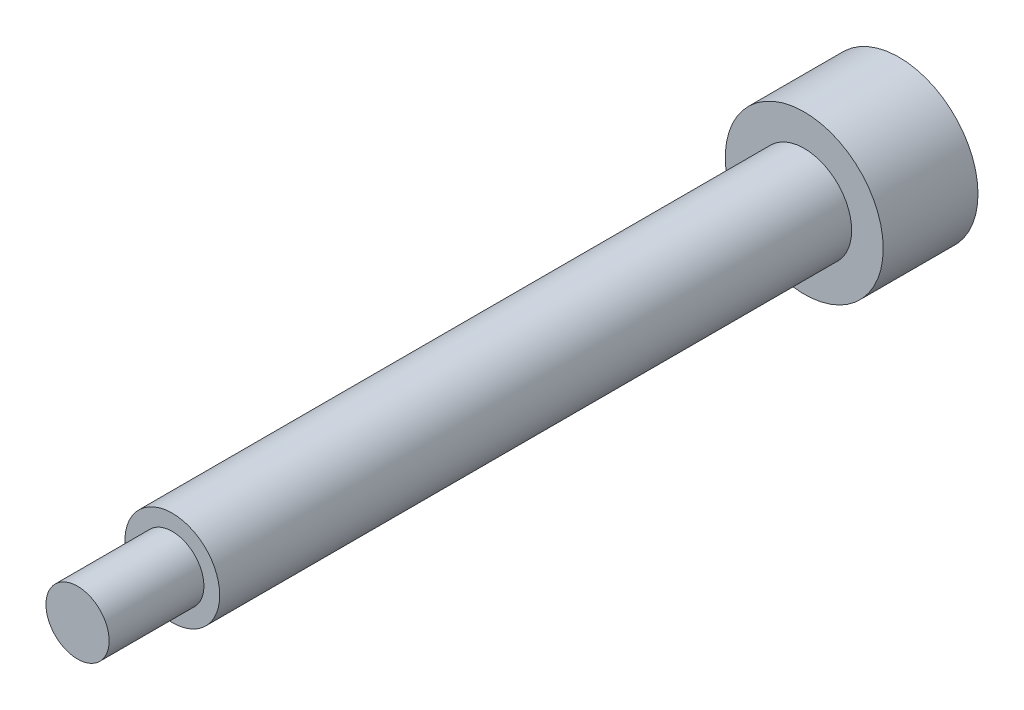
ISO-10303-21;
HEADER;
FILE_DESCRIPTION(('STEP AP214'),'2;1');
FILE_NAME('part.step','',(''),(''),'','','');
FILE_SCHEMA(('AUTOMOTIVE_DESIGN { 1 0 10303 214 1 1 1 1 }'));
ENDSEC;
DATA;
#1=APPLICATION_CONTEXT('core data for automotive mechanical design processes');
#2=APPLICATION_PROTOCOL_DEFINITION('international standard','automotive_design',2000,#1);
#3=PRODUCT_CONTEXT('',#1,'mechanical');
#4=PRODUCT('Part','Part','',(#3));
#5=PRODUCT_RELATED_PRODUCT_CATEGORY('part','',(#4));
#6=PRODUCT_DEFINITION_FORMATION('','',#4);
#7=PRODUCT_DEFINITION_CONTEXT('part definition',#1,'design');
#8=PRODUCT_DEFINITION('design','',#6,#7);
#9=PRODUCT_DEFINITION_SHAPE('','',#8);
#10=(LENGTH_UNIT() NAMED_UNIT(*) SI_UNIT(.MILLI.,.METRE.));
#11=(NAMED_UNIT(*) PLANE_ANGLE_UNIT() SI_UNIT($,.RADIAN.));
#12=(NAMED_UNIT(*) SI_UNIT($,.STERADIAN.) SOLID_ANGLE_UNIT());
#13=UNCERTAINTY_MEASURE_WITH_UNIT(LENGTH_MEASURE(1.E-05),#10,'distance_accuracy_value','');
#14=(GEOMETRIC_REPRESENTATION_CONTEXT(3) GLOBAL_UNCERTAINTY_ASSIGNED_CONTEXT((#13)) GLOBAL_UNIT_ASSIGNED_CONTEXT((#10,
#11,#12)) REPRESENTATION_CONTEXT('',''));
#15=CARTESIAN_POINT('',(0.,0.,0.));
#16=DIRECTION('',(0.,0.,1.));
#17=DIRECTION('',(1.,0.,0.));
#18=AXIS2_PLACEMENT_3D('',#15,#16,#17);
#19=CARTESIAN_POINT('',(0.,0.,0.));
#20=DIRECTION('',(0.,0.,1.));
#21=DIRECTION('',(1.,0.,0.));
#22=AXIS2_PLACEMENT_3D('',#19,#20,#21);
#23=PLANE('',#22);
#24=CARTESIAN_POINT('',(0.,0.,0.));
#25=DIRECTION('',(0.,0.,1.));
#26=DIRECTION('',(1.,0.,0.));
#27=AXIS2_PLACEMENT_3D('',#24,#25,#26);
#28=CIRCLE('',#27,5.);
#29=CARTESIAN_POINT('',(5.,0.,0.));
#30=VERTEX_POINT('',#29);
#31=EDGE_CURVE('E43',#30,#30,#28,.T.);
#32=ORIENTED_EDGE('',*,*,#31,.F.);
#33=EDGE_LOOP('',(#32));
#34=FACE_BOUND('',#33,.T.);
#35=DIRECTION('',(1.,0.,0.));
#36=VECTOR('',#35,1.);
#37=CARTESIAN_POINT('',(0.,-1.,0.));
#38=LINE('',#37,#36);
#39=CARTESIAN_POINT('',(-1.1180339887499,-1.,0.));
#40=VERTEX_POINT('',#39);
#41=CARTESIAN_POINT('',(1.1180339887499,-1.,0.));
#42=VERTEX_POINT('',#41);
#43=EDGE_CURVE('E57',#40,#42,#38,.T.);
#44=ORIENTED_EDGE('',*,*,#43,.T.);
#45=CARTESIAN_POINT('',(0.,0.,0.));
#46=DIRECTION('',(0.,0.,-1.));
#47=DIRECTION('',(-1.,0.,0.));
#48=AXIS2_PLACEMENT_3D('',#45,#46,#47);
#49=CIRCLE('',#48,1.5);
#50=EDGE_CURVE('E77',#40,#42,#49,.T.);
#51=ORIENTED_EDGE('',*,*,#50,.F.);
#52=EDGE_LOOP('',(#44,#51));
#53=FACE_BOUND('',#52,.T.);
#54=ADVANCED_FACE('F39',(#34,#53),#23,.F.);
#55=CARTESIAN_POINT('',(0.,0.,6.));
#56=DIRECTION('',(0.,0.,-1.));
#57=DIRECTION('',(-1.,0.,0.));
#58=AXIS2_PLACEMENT_3D('',#55,#56,#57);
#59=CYLINDRICAL_SURFACE('',#58,5.);
#60=CARTESIAN_POINT('',(0.,0.,6.));
#61=DIRECTION('',(0.,0.,1.));
#62=DIRECTION('',(1.,0.,0.));
#63=AXIS2_PLACEMENT_3D('',#60,#61,#62);
#64=CIRCLE('',#63,5.);
#65=CARTESIAN_POINT('',(5.,0.,6.));
#66=VERTEX_POINT('',#65);
#67=EDGE_CURVE('E94',#66,#66,#64,.T.);
#68=ORIENTED_EDGE('',*,*,#67,.F.);
#69=EDGE_LOOP('',(#68));
#70=FACE_BOUND('',#69,.T.);
#71=ORIENTED_EDGE('',*,*,#31,.T.);
#72=EDGE_LOOP('',(#71));
#73=FACE_BOUND('',#72,.T.);
#74=ADVANCED_FACE('F41',(#70,#73),#59,.T.);
#75=CARTESIAN_POINT('',(0.,0.,6.));
#76=DIRECTION('',(0.,0.,1.));
#77=DIRECTION('',(1.,0.,0.));
#78=AXIS2_PLACEMENT_3D('',#75,#76,#77);
#79=PLANE('',#78);
#80=CARTESIAN_POINT('',(0.,0.,6.));
#81=DIRECTION('',(0.,0.,1.));
#82=DIRECTION('',(1.,0.,0.));
#83=AXIS2_PLACEMENT_3D('',#80,#81,#82);
#84=CIRCLE('',#83,3.);
#85=CARTESIAN_POINT('',(3.,0.,6.));
#86=VERTEX_POINT('',#85);
#87=EDGE_CURVE('E49',#86,#86,#84,.T.);
#88=ORIENTED_EDGE('',*,*,#87,.F.);
#89=EDGE_LOOP('',(#88));
#90=FACE_BOUND('',#89,.T.);
#91=ORIENTED_EDGE('',*,*,#67,.T.);
#92=EDGE_LOOP('',(#91));
#93=FACE_BOUND('',#92,.T.);
#94=ADVANCED_FACE('F111',(#90,#93),#79,.T.);
#95=CARTESIAN_POINT('',(0.,-1.,5.));
#96=DIRECTION('',(0.,1.,0.));
#97=DIRECTION('',(0.,0.,1.));
#98=AXIS2_PLACEMENT_3D('',#95,#96,#97);
#99=PLANE('',#98);
#100=ORIENTED_EDGE('',*,*,#43,.F.);
#101=DIRECTION('',(0.,0.,-1.));
#102=VECTOR('',#101,1.);
#103=CARTESIAN_POINT('',(-1.1180339887499,-1.,5.));
#104=LINE('',#103,#102);
#105=CARTESIAN_POINT('',(-1.1180339887499,-1.,5.));
#106=VERTEX_POINT('',#105);
#107=EDGE_CURVE('E74',#106,#40,#104,.T.);
#108=ORIENTED_EDGE('',*,*,#107,.F.);
#109=DIRECTION('',(1.,0.,0.));
#110=VECTOR('',#109,1.);
#111=CARTESIAN_POINT('',(0.,-1.,5.));
#112=LINE('',#111,#110);
#113=CARTESIAN_POINT('',(1.1180339887499,-1.,5.));
#114=VERTEX_POINT('',#113);
#115=EDGE_CURVE('E63',#106,#114,#112,.T.);
#116=ORIENTED_EDGE('',*,*,#115,.T.);
#117=DIRECTION('',(0.,0.,-1.));
#118=VECTOR('',#117,1.);
#119=CARTESIAN_POINT('',(1.1180339887499,-1.,5.));
#120=LINE('',#119,#118);
#121=EDGE_CURVE('E67',#114,#42,#120,.T.);
#122=ORIENTED_EDGE('',*,*,#121,.T.);
#123=EDGE_LOOP('',(#100,#108,#116,#122));
#124=FACE_BOUND('',#123,.T.);
#125=ADVANCED_FACE('F69',(#124),#99,.T.);
#126=CARTESIAN_POINT('',(0.,0.,5.));
#127=DIRECTION('',(0.,0.,-1.));
#128=DIRECTION('',(-1.,0.,0.));
#129=AXIS2_PLACEMENT_3D('',#126,#127,#128);
#130=CYLINDRICAL_SURFACE('',#129,1.5);
#131=ORIENTED_EDGE('',*,*,#50,.T.);
#132=ORIENTED_EDGE('',*,*,#121,.F.);
#133=CARTESIAN_POINT('',(0.,0.,5.));
#134=DIRECTION('',(0.,0.,-1.));
#135=DIRECTION('',(-1.,0.,0.));
#136=AXIS2_PLACEMENT_3D('',#133,#134,#135);
#137=CIRCLE('',#136,1.5);
#138=EDGE_CURVE('E90',#106,#114,#137,.T.);
#139=ORIENTED_EDGE('',*,*,#138,.F.);
#140=ORIENTED_EDGE('',*,*,#107,.T.);
#141=EDGE_LOOP('',(#131,#132,#139,#140));
#142=FACE_BOUND('',#141,.T.);
#143=ADVANCED_FACE('F78',(#142),#130,.F.);
#144=CARTESIAN_POINT('',(0.,0.,5.));
#145=DIRECTION('',(0.,0.,-1.));
#146=DIRECTION('',(-1.,0.,0.));
#147=AXIS2_PLACEMENT_3D('',#144,#145,#146);
#148=PLANE('',#147);
#149=ORIENTED_EDGE('',*,*,#115,.F.);
#150=ORIENTED_EDGE('',*,*,#138,.T.);
#151=EDGE_LOOP('',(#149,#150));
#152=FACE_BOUND('',#151,.T.);
#153=ADVANCED_FACE('F121',(#152),#148,.T.);
#154=CARTESIAN_POINT('',(0.,0.,46.));
#155=DIRECTION('',(0.,0.,-1.));
#156=DIRECTION('',(-1.,0.,0.));
#157=AXIS2_PLACEMENT_3D('',#154,#155,#156);
#158=CYLINDRICAL_SURFACE('',#157,3.);
#159=CARTESIAN_POINT('',(0.,0.,46.));
#160=DIRECTION('',(0.,0.,1.));
#161=DIRECTION('',(1.,0.,0.));
#162=AXIS2_PLACEMENT_3D('',#159,#160,#161);
#163=CIRCLE('',#162,3.);
#164=CARTESIAN_POINT('',(3.,0.,46.));
#165=VERTEX_POINT('',#164);
#166=EDGE_CURVE('E83',#165,#165,#163,.T.);
#167=ORIENTED_EDGE('',*,*,#166,.F.);
#168=EDGE_LOOP('',(#167));
#169=FACE_BOUND('',#168,.T.);
#170=ORIENTED_EDGE('',*,*,#87,.T.);
#171=EDGE_LOOP('',(#170));
#172=FACE_BOUND('',#171,.T.);
#173=ADVANCED_FACE('F124',(#169,#172),#158,.T.);
#174=CARTESIAN_POINT('',(0.,0.,46.));
#175=DIRECTION('',(0.,0.,1.));
#176=DIRECTION('',(1.,0.,0.));
#177=AXIS2_PLACEMENT_3D('',#174,#175,#176);
#178=PLANE('',#177);
#179=CARTESIAN_POINT('',(0.,0.,46.));
#180=DIRECTION('',(0.,0.,1.));
#181=DIRECTION('',(1.,0.,0.));
#182=AXIS2_PLACEMENT_3D('',#179,#180,#181);
#183=CIRCLE('',#182,2.);
#184=CARTESIAN_POINT('',(2.,0.,46.));
#185=VERTEX_POINT('',#184);
#186=EDGE_CURVE('E11',#185,#185,#183,.T.);
#187=ORIENTED_EDGE('',*,*,#186,.F.);
#188=EDGE_LOOP('',(#187));
#189=FACE_BOUND('',#188,.T.);
#190=ORIENTED_EDGE('',*,*,#166,.T.);
#191=EDGE_LOOP('',(#190));
#192=FACE_BOUND('',#191,.T.);
#193=ADVANCED_FACE('F128',(#189,#192),#178,.T.);
#194=CARTESIAN_POINT('',(0.,0.,52.));
#195=DIRECTION('',(0.,0.,-1.));
#196=DIRECTION('',(-1.,0.,0.));
#197=AXIS2_PLACEMENT_3D('',#194,#195,#196);
#198=CYLINDRICAL_SURFACE('',#197,2.);
#199=CARTESIAN_POINT('',(0.,0.,52.));
#200=DIRECTION('',(0.,0.,1.));
#201=DIRECTION('',(1.,0.,0.));
#202=AXIS2_PLACEMENT_3D('',#199,#200,#201);
#203=CIRCLE('',#202,2.);
#204=CARTESIAN_POINT('',(2.,0.,52.));
#205=VERTEX_POINT('',#204);
#206=EDGE_CURVE('E87',#205,#205,#203,.T.);
#207=ORIENTED_EDGE('',*,*,#206,.F.);
#208=EDGE_LOOP('',(#207));
#209=FACE_BOUND('',#208,.T.);
#210=ORIENTED_EDGE('',*,*,#186,.T.);
#211=EDGE_LOOP('',(#210));
#212=FACE_BOUND('',#211,.T.);
#213=ADVANCED_FACE('F132',(#209,#212),#198,.T.);
#214=CARTESIAN_POINT('',(0.,0.,52.));
#215=DIRECTION('',(0.,0.,1.));
#216=DIRECTION('',(1.,0.,0.));
#217=AXIS2_PLACEMENT_3D('',#214,#215,#216);
#218=PLANE('',#217);
#219=ORIENTED_EDGE('',*,*,#206,.T.);
#220=EDGE_LOOP('',(#219));
#221=FACE_BOUND('',#220,.T.);
#222=ADVANCED_FACE('F136',(#221),#218,.T.);
#223=CLOSED_SHELL('',(#54,#74,#94,#125,#143,#153,#173,#193,#213,#222));
#224=MANIFOLD_SOLID_BREP('B2',#223);
#225=ADVANCED_BREP_SHAPE_REPRESENTATION('',(#18,#224),#14);
#226=SHAPE_DEFINITION_REPRESENTATION(#9,#225);
ENDSEC;
END-ISO-10303-21;
